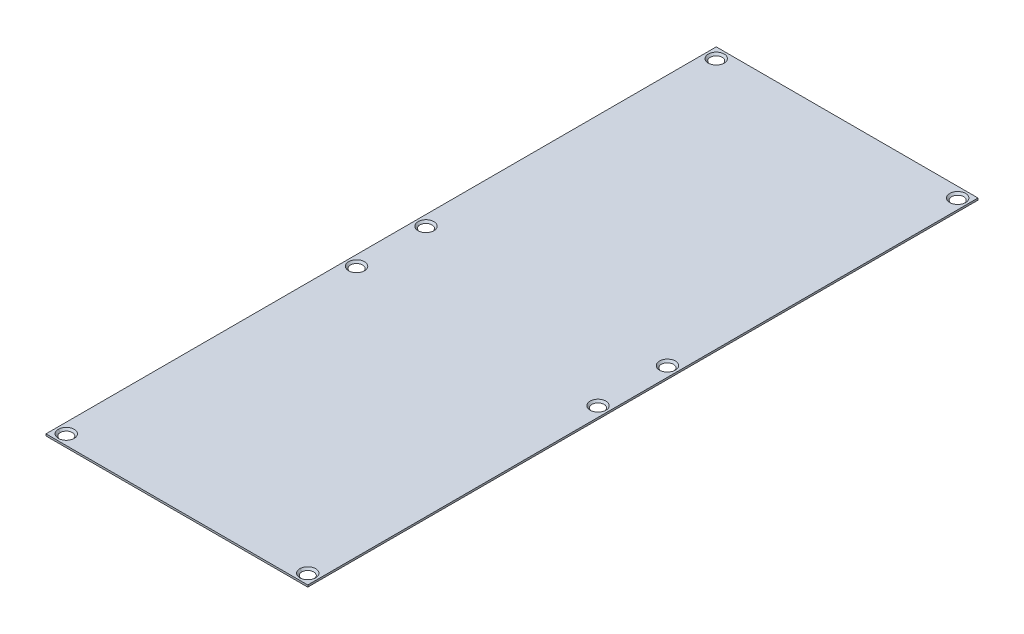
ISO-10303-21;
HEADER;
FILE_DESCRIPTION(('STEP AP214'),'2;1');
FILE_NAME('part.step','',(''),(''),'','','');
FILE_SCHEMA(('AUTOMOTIVE_DESIGN { 1 0 10303 214 1 1 1 1 }'));
ENDSEC;
DATA;
#1=APPLICATION_CONTEXT('core data for automotive mechanical design processes');
#2=APPLICATION_PROTOCOL_DEFINITION('international standard','automotive_design',2000,#1);
#3=PRODUCT_CONTEXT('',#1,'mechanical');
#4=PRODUCT('Part','Part','',(#3));
#5=PRODUCT_RELATED_PRODUCT_CATEGORY('part','',(#4));
#6=PRODUCT_DEFINITION_FORMATION('','',#4);
#7=PRODUCT_DEFINITION_CONTEXT('part definition',#1,'design');
#8=PRODUCT_DEFINITION('design','',#6,#7);
#9=PRODUCT_DEFINITION_SHAPE('','',#8);
#10=(LENGTH_UNIT() NAMED_UNIT(*) SI_UNIT(.MILLI.,.METRE.));
#11=(NAMED_UNIT(*) PLANE_ANGLE_UNIT() SI_UNIT($,.RADIAN.));
#12=(NAMED_UNIT(*) SI_UNIT($,.STERADIAN.) SOLID_ANGLE_UNIT());
#13=UNCERTAINTY_MEASURE_WITH_UNIT(LENGTH_MEASURE(1.E-05),#10,'distance_accuracy_value','');
#14=(GEOMETRIC_REPRESENTATION_CONTEXT(3) GLOBAL_UNCERTAINTY_ASSIGNED_CONTEXT((#13)) GLOBAL_UNIT_ASSIGNED_CONTEXT((#10,
#11,#12)) REPRESENTATION_CONTEXT('',''));
#15=CARTESIAN_POINT('',(0.,0.,0.));
#16=DIRECTION('',(0.,0.,1.));
#17=DIRECTION('',(1.,0.,0.));
#18=AXIS2_PLACEMENT_3D('',#15,#16,#17);
#19=CARTESIAN_POINT('',(50.,-0.2,113.5));
#20=DIRECTION('',(0.,1.,0.));
#21=DIRECTION('',(0.,0.,1.));
#22=AXIS2_PLACEMENT_3D('',#19,#20,#21);
#23=PLANE('',#22);
#24=CARTESIAN_POINT('',(88.1,-0.2,124.45));
#25=DIRECTION('',(0.,1.,0.));
#26=DIRECTION('',(0.,0.,1.));
#27=AXIS2_PLACEMENT_3D('',#24,#25,#26);
#28=CIRCLE('',#27,2.49996925633269);
#29=CARTESIAN_POINT('',(88.1,-0.2,126.949969256333));
#30=VERTEX_POINT('',#29);
#31=EDGE_CURVE('E131',#30,#30,#28,.F.);
#32=ORIENTED_EDGE('',*,*,#31,.T.);
#33=EDGE_LOOP('',(#32));
#34=FACE_BOUND('',#33,.T.);
#35=CARTESIAN_POINT('',(11.9,-0.2,216.05));
#36=DIRECTION('',(0.,1.,0.));
#37=DIRECTION('',(0.,0.,1.));
#38=AXIS2_PLACEMENT_3D('',#35,#36,#37);
#39=CIRCLE('',#38,2.49996925636078);
#40=CARTESIAN_POINT('',(14.3999692563546,-0.199999999971578,216.05));
#41=VERTEX_POINT('',#40);
#42=CARTESIAN_POINT('',(9.40003074361703,-0.199999999971578,216.05));
#43=VERTEX_POINT('',#42);
#44=EDGE_CURVE('E135',#41,#43,#39,.F.);
#45=ORIENTED_EDGE('',*,*,#44,.T.);
#46=CARTESIAN_POINT('',(11.9,-0.2,216.05));
#47=DIRECTION('',(0.,1.,0.));
#48=DIRECTION('',(0.,0.,1.));
#49=AXIS2_PLACEMENT_3D('',#46,#47,#48);
#50=CIRCLE('',#49,2.49996925636077);
#51=EDGE_CURVE('E139',#43,#41,#50,.F.);
#52=ORIENTED_EDGE('',*,*,#51,.T.);
#53=EDGE_LOOP('',(#45,#52));
#54=FACE_BOUND('',#53,.T.);
#55=CARTESIAN_POINT('',(11.9,-0.2,124.45));
#56=DIRECTION('',(0.,1.,0.));
#57=DIRECTION('',(0.,0.,1.));
#58=AXIS2_PLACEMENT_3D('',#55,#56,#57);
#59=CIRCLE('',#58,2.49996925633269);
#60=CARTESIAN_POINT('',(11.9,-0.2,126.949969256333));
#61=VERTEX_POINT('',#60);
#62=EDGE_CURVE('E142',#61,#61,#59,.F.);
#63=ORIENTED_EDGE('',*,*,#62,.T.);
#64=EDGE_LOOP('',(#63));
#65=FACE_BOUND('',#64,.T.);
#66=CARTESIAN_POINT('',(88.1,-0.2,102.55));
#67=DIRECTION('',(0.,1.,0.));
#68=DIRECTION('',(0.,0.,1.));
#69=AXIS2_PLACEMENT_3D('',#66,#67,#68);
#70=CIRCLE('',#69,2.49996925631623);
#71=CARTESIAN_POINT('',(88.1,-0.2,105.049969256316));
#72=VERTEX_POINT('',#71);
#73=EDGE_CURVE('E145',#72,#72,#70,.F.);
#74=ORIENTED_EDGE('',*,*,#73,.T.);
#75=EDGE_LOOP('',(#74));
#76=FACE_BOUND('',#75,.T.);
#77=CARTESIAN_POINT('',(11.9,-0.2,10.95));
#78=DIRECTION('',(0.,1.,0.));
#79=DIRECTION('',(0.,0.,1.));
#80=AXIS2_PLACEMENT_3D('',#77,#78,#79);
#81=CIRCLE('',#80,2.49996925634497);
#82=CARTESIAN_POINT('',(11.9,-0.2,13.449969256345));
#83=VERTEX_POINT('',#82);
#84=EDGE_CURVE('E148',#83,#83,#81,.F.);
#85=ORIENTED_EDGE('',*,*,#84,.T.);
#86=EDGE_LOOP('',(#85));
#87=FACE_BOUND('',#86,.T.);
#88=CARTESIAN_POINT('',(88.1,-0.2,10.95));
#89=DIRECTION('',(0.,1.,0.));
#90=DIRECTION('',(0.,0.,1.));
#91=AXIS2_PLACEMENT_3D('',#88,#89,#90);
#92=CIRCLE('',#91,2.49996925634497);
#93=CARTESIAN_POINT('',(88.1,-0.2,13.449969256345));
#94=VERTEX_POINT('',#93);
#95=EDGE_CURVE('E151',#94,#94,#92,.F.);
#96=ORIENTED_EDGE('',*,*,#95,.T.);
#97=EDGE_LOOP('',(#96));
#98=FACE_BOUND('',#97,.T.);
#99=CARTESIAN_POINT('',(11.9,-0.2,102.55));
#100=DIRECTION('',(0.,1.,0.));
#101=DIRECTION('',(0.,0.,1.));
#102=AXIS2_PLACEMENT_3D('',#99,#100,#101);
#103=CIRCLE('',#102,2.49996925631623);
#104=CARTESIAN_POINT('',(11.9,-0.2,105.049969256316));
#105=VERTEX_POINT('',#104);
#106=EDGE_CURVE('E154',#105,#105,#103,.F.);
#107=ORIENTED_EDGE('',*,*,#106,.T.);
#108=EDGE_LOOP('',(#107));
#109=FACE_BOUND('',#108,.T.);
#110=CARTESIAN_POINT('',(88.1,-0.2,216.05));
#111=DIRECTION('',(0.,1.,0.));
#112=DIRECTION('',(0.,0.,1.));
#113=AXIS2_PLACEMENT_3D('',#110,#111,#112);
#114=CIRCLE('',#113,2.49996925636077);
#115=CARTESIAN_POINT('',(90.5999692563261,-0.200000000028422,216.05));
#116=VERTEX_POINT('',#115);
#117=CARTESIAN_POINT('',(85.6000307436739,-0.200000000028422,216.05));
#118=VERTEX_POINT('',#117);
#119=EDGE_CURVE('E63',#116,#118,#114,.F.);
#120=ORIENTED_EDGE('',*,*,#119,.T.);
#121=CARTESIAN_POINT('',(88.1,-0.2,216.05));
#122=DIRECTION('',(0.,1.,0.));
#123=DIRECTION('',(0.,0.,1.));
#124=AXIS2_PLACEMENT_3D('',#121,#122,#123);
#125=CIRCLE('',#124,2.49996925636078);
#126=EDGE_CURVE('E20',#118,#116,#125,.F.);
#127=ORIENTED_EDGE('',*,*,#126,.T.);
#128=EDGE_LOOP('',(#120,#127));
#129=FACE_BOUND('',#128,.T.);
#130=DIRECTION('',(1.,0.,0.));
#131=VECTOR('',#130,1.);
#132=CARTESIAN_POINT('',(50.,-0.2,219.25));
#133=LINE('',#132,#131);
#134=CARTESIAN_POINT('',(91.3,-0.2,219.25));
#135=VERTEX_POINT('',#134);
#136=CARTESIAN_POINT('',(8.7,-0.2,219.25));
#137=VERTEX_POINT('',#136);
#138=EDGE_CURVE('E73',#135,#137,#133,.F.);
#139=ORIENTED_EDGE('',*,*,#138,.F.);
#140=DIRECTION('',(0.,0.,-1.));
#141=VECTOR('',#140,1.);
#142=CARTESIAN_POINT('',(91.3,-0.2,113.5));
#143=LINE('',#142,#141);
#144=CARTESIAN_POINT('',(91.3,-0.2,7.74999999999999));
#145=VERTEX_POINT('',#144);
#146=EDGE_CURVE('E87',#145,#135,#143,.F.);
#147=ORIENTED_EDGE('',*,*,#146,.F.);
#148=DIRECTION('',(1.,0.,0.));
#149=VECTOR('',#148,1.);
#150=CARTESIAN_POINT('',(50.,-0.2,7.75));
#151=LINE('',#150,#149);
#152=CARTESIAN_POINT('',(8.7,-0.2,7.75));
#153=VERTEX_POINT('',#152);
#154=EDGE_CURVE('E85',#145,#153,#151,.F.);
#155=ORIENTED_EDGE('',*,*,#154,.T.);
#156=DIRECTION('',(0.,0.,-1.));
#157=VECTOR('',#156,1.);
#158=CARTESIAN_POINT('',(8.7,-0.2,113.5));
#159=LINE('',#158,#157);
#160=EDGE_CURVE('E172',#153,#137,#159,.F.);
#161=ORIENTED_EDGE('',*,*,#160,.T.);
#162=EDGE_LOOP('',(#139,#147,#155,#161));
#163=FACE_BOUND('',#162,.T.);
#164=ADVANCED_FACE('F17',(#34,#54,#65,#76,#87,#98,#109,#129,#163),#23,.T.);
#165=CARTESIAN_POINT('',(91.3,-0.5,113.5));
#166=DIRECTION('',(1.,0.,0.));
#167=DIRECTION('',(0.,0.,-1.));
#168=AXIS2_PLACEMENT_3D('',#165,#166,#167);
#169=PLANE('',#168);
#170=DIRECTION('',(0.,1.,0.));
#171=VECTOR('',#170,1.);
#172=CARTESIAN_POINT('',(91.3,-0.5,219.25));
#173=LINE('',#172,#171);
#174=CARTESIAN_POINT('',(91.3,-0.8,219.25));
#175=VERTEX_POINT('',#174);
#176=EDGE_CURVE('E167',#175,#135,#173,.T.);
#177=ORIENTED_EDGE('',*,*,#176,.F.);
#178=DIRECTION('',(0.,0.,1.));
#179=VECTOR('',#178,1.);
#180=CARTESIAN_POINT('',(91.3,-0.8,113.5));
#181=LINE('',#180,#179);
#182=CARTESIAN_POINT('',(91.3,-0.8,7.74999999999999));
#183=VERTEX_POINT('',#182);
#184=EDGE_CURVE('E105',#175,#183,#181,.F.);
#185=ORIENTED_EDGE('',*,*,#184,.T.);
#186=DIRECTION('',(0.,1.,0.));
#187=VECTOR('',#186,1.);
#188=CARTESIAN_POINT('',(91.3,-0.5,7.75));
#189=LINE('',#188,#187);
#190=EDGE_CURVE('E91',#183,#145,#189,.T.);
#191=ORIENTED_EDGE('',*,*,#190,.T.);
#192=ORIENTED_EDGE('',*,*,#146,.T.);
#193=EDGE_LOOP('',(#177,#185,#191,#192));
#194=FACE_BOUND('',#193,.T.);
#195=ADVANCED_FACE('F103',(#194),#169,.T.);
#196=CARTESIAN_POINT('',(50.,-0.5,7.75));
#197=DIRECTION('',(0.,0.,1.));
#198=DIRECTION('',(1.,0.,0.));
#199=AXIS2_PLACEMENT_3D('',#196,#197,#198);
#200=PLANE('',#199);
#201=ORIENTED_EDGE('',*,*,#154,.F.);
#202=ORIENTED_EDGE('',*,*,#190,.F.);
#203=DIRECTION('',(1.,0.,0.));
#204=VECTOR('',#203,1.);
#205=CARTESIAN_POINT('',(50.,-0.8,7.74999999999999));
#206=LINE('',#205,#204);
#207=CARTESIAN_POINT('',(8.7,-0.8,7.75));
#208=VERTEX_POINT('',#207);
#209=EDGE_CURVE('E181',#183,#208,#206,.F.);
#210=ORIENTED_EDGE('',*,*,#209,.T.);
#211=DIRECTION('',(0.,1.,0.));
#212=VECTOR('',#211,1.);
#213=CARTESIAN_POINT('',(8.7,-0.5,7.74999999999999));
#214=LINE('',#213,#212);
#215=EDGE_CURVE('E100',#208,#153,#214,.T.);
#216=ORIENTED_EDGE('',*,*,#215,.T.);
#217=EDGE_LOOP('',(#201,#202,#210,#216));
#218=FACE_BOUND('',#217,.T.);
#219=ADVANCED_FACE('F96',(#218),#200,.F.);
#220=CARTESIAN_POINT('',(8.7,-0.5,113.5));
#221=DIRECTION('',(1.,0.,0.));
#222=DIRECTION('',(0.,0.,-1.));
#223=AXIS2_PLACEMENT_3D('',#220,#221,#222);
#224=PLANE('',#223);
#225=ORIENTED_EDGE('',*,*,#160,.F.);
#226=ORIENTED_EDGE('',*,*,#215,.F.);
#227=DIRECTION('',(0.,0.,1.));
#228=VECTOR('',#227,1.);
#229=CARTESIAN_POINT('',(8.7,-0.8,113.5));
#230=LINE('',#229,#228);
#231=CARTESIAN_POINT('',(8.7,-0.8,219.25));
#232=VERTEX_POINT('',#231);
#233=EDGE_CURVE('E177',#208,#232,#230,.T.);
#234=ORIENTED_EDGE('',*,*,#233,.T.);
#235=DIRECTION('',(0.,1.,0.));
#236=VECTOR('',#235,1.);
#237=CARTESIAN_POINT('',(8.7,-0.5,219.25));
#238=LINE('',#237,#236);
#239=EDGE_CURVE('E161',#137,#232,#238,.F.);
#240=ORIENTED_EDGE('',*,*,#239,.F.);
#241=EDGE_LOOP('',(#225,#226,#234,#240));
#242=FACE_BOUND('',#241,.T.);
#243=ADVANCED_FACE('F175',(#242),#224,.F.);
#244=CARTESIAN_POINT('',(50.,-0.5,219.25));
#245=DIRECTION('',(0.,0.,1.));
#246=DIRECTION('',(1.,0.,0.));
#247=AXIS2_PLACEMENT_3D('',#244,#245,#246);
#248=PLANE('',#247);
#249=ORIENTED_EDGE('',*,*,#239,.T.);
#250=DIRECTION('',(1.,0.,0.));
#251=VECTOR('',#250,1.);
#252=CARTESIAN_POINT('',(50.,-0.8,219.25));
#253=LINE('',#252,#251);
#254=EDGE_CURVE('E130',#232,#175,#253,.T.);
#255=ORIENTED_EDGE('',*,*,#254,.T.);
#256=ORIENTED_EDGE('',*,*,#176,.T.);
#257=ORIENTED_EDGE('',*,*,#138,.T.);
#258=EDGE_LOOP('',(#249,#255,#256,#257));
#259=FACE_BOUND('',#258,.T.);
#260=ADVANCED_FACE('F265',(#259),#248,.T.);
#261=CARTESIAN_POINT('',(88.1,-0.199989925818045,216.05));
#262=DIRECTION('',(0.,1.,0.));
#263=DIRECTION('',(0.,0.,1.));
#264=AXIS2_PLACEMENT_3D('',#261,#262,#263);
#265=CONICAL_SURFACE('',#264,2.49997933041884,0.785392014615525);
#266=CARTESIAN_POINT('',(88.1,-0.800000000026557,216.05));
#267=DIRECTION('',(0.,1.,0.));
#268=DIRECTION('',(0.,0.,1.));
#269=AXIS2_PLACEMENT_3D('',#266,#267,#268);
#270=CIRCLE('',#269,1.89997663482716);
#271=CARTESIAN_POINT('',(86.2000233651707,-0.799999999998136,216.05));
#272=VERTEX_POINT('',#271);
#273=CARTESIAN_POINT('',(89.9999766348294,-0.799999999969714,216.05));
#274=VERTEX_POINT('',#273);
#275=EDGE_CURVE('E128',#272,#274,#270,.F.);
#276=ORIENTED_EDGE('',*,*,#275,.T.);
#277=DIRECTION('',(-0.707102433349938,-0.707111128996423,0.));
#278=VECTOR('',#277,1.);
#279=CARTESIAN_POINT('',(498872.05,498787.383833936,216.050000000031));
#280=LINE('',#279,#278);
#281=EDGE_CURVE('E156',#274,#116,#280,.F.);
#282=ORIENTED_EDGE('',*,*,#281,.T.);
#283=ORIENTED_EDGE('',*,*,#126,.F.);
#284=DIRECTION('',(0.707102433349938,-0.707111128996423,0.));
#285=VECTOR('',#284,1.);
#286=CARTESIAN_POINT('',(-498695.85,498787.383833936,216.049999999908));
#287=LINE('',#286,#285);
#288=EDGE_CURVE('E157',#118,#272,#287,.T.);
#289=ORIENTED_EDGE('',*,*,#288,.T.);
#290=EDGE_LOOP('',(#276,#282,#283,#289));
#291=FACE_BOUND('',#290,.T.);
#292=ADVANCED_FACE('F224',(#291),#265,.F.);
#293=CARTESIAN_POINT('',(88.1,-0.199989925931732,216.05));
#294=DIRECTION('',(0.,1.,0.));
#295=DIRECTION('',(0.,0.,1.));
#296=AXIS2_PLACEMENT_3D('',#293,#294,#295);
#297=CONICAL_SURFACE('',#296,2.49997933030516,0.785392014662892);
#298=CARTESIAN_POINT('',(88.1,-0.799999999969714,216.05));
#299=DIRECTION('',(0.,1.,0.));
#300=DIRECTION('',(0.,0.,1.));
#301=AXIS2_PLACEMENT_3D('',#298,#299,#300);
#302=CIRCLE('',#301,1.89997663482716);
#303=EDGE_CURVE('E126',#274,#272,#302,.F.);
#304=ORIENTED_EDGE('',*,*,#303,.T.);
#305=ORIENTED_EDGE('',*,*,#288,.F.);
#306=ORIENTED_EDGE('',*,*,#119,.F.);
#307=ORIENTED_EDGE('',*,*,#281,.F.);
#308=EDGE_LOOP('',(#304,#305,#306,#307));
#309=FACE_BOUND('',#308,.T.);
#310=ADVANCED_FACE('F213',(#309),#297,.F.);
#311=CARTESIAN_POINT('',(11.9,-0.199989925818045,102.55));
#312=DIRECTION('',(0.,1.,0.));
#313=DIRECTION('',(0.,0.,1.));
#314=AXIS2_PLACEMENT_3D('',#311,#312,#313);
#315=CONICAL_SURFACE('',#314,2.4999793303743,0.785392014615524);
#316=CARTESIAN_POINT('',(11.9,-0.799999999969714,102.55));
#317=DIRECTION('',(0.,1.,0.));
#318=DIRECTION('',(0.,0.,1.));
#319=AXIS2_PLACEMENT_3D('',#316,#317,#318);
#320=CIRCLE('',#319,1.89997663483946);
#321=CARTESIAN_POINT('',(11.9,-0.799999999969714,104.449976634839));
#322=VERTEX_POINT('',#321);
#323=EDGE_CURVE('E123',#322,#322,#320,.F.);
#324=ORIENTED_EDGE('',*,*,#323,.T.);
#325=EDGE_LOOP('',(#324));
#326=FACE_BOUND('',#325,.T.);
#327=ORIENTED_EDGE('',*,*,#106,.F.);
#328=EDGE_LOOP('',(#327));
#329=FACE_BOUND('',#328,.T.);
#330=ADVANCED_FACE('F210',(#326,#329),#315,.F.);
#331=CARTESIAN_POINT('',(88.1,-0.199989925761201,10.95));
#332=DIRECTION('',(0.,1.,0.));
#333=DIRECTION('',(0.,0.,1.));
#334=AXIS2_PLACEMENT_3D('',#331,#332,#333);
#335=CONICAL_SURFACE('',#334,2.49997933045988,0.785392014615523);
#336=CARTESIAN_POINT('',(88.1,-0.799999999969714,10.95));
#337=DIRECTION('',(0.,1.,0.));
#338=DIRECTION('',(0.,0.,1.));
#339=AXIS2_PLACEMENT_3D('',#336,#337,#338);
#340=CIRCLE('',#339,1.8999766348682);
#341=CARTESIAN_POINT('',(88.1,-0.799999999969714,12.8499766348682));
#342=VERTEX_POINT('',#341);
#343=EDGE_CURVE('E120',#342,#342,#340,.F.);
#344=ORIENTED_EDGE('',*,*,#343,.T.);
#345=EDGE_LOOP('',(#344));
#346=FACE_BOUND('',#345,.T.);
#347=ORIENTED_EDGE('',*,*,#95,.F.);
#348=EDGE_LOOP('',(#347));
#349=FACE_BOUND('',#348,.T.);
#350=ADVANCED_FACE('F212',(#346,#349),#335,.F.);
#351=CARTESIAN_POINT('',(11.9,-0.199989925761201,10.95));
#352=DIRECTION('',(0.,1.,0.));
#353=DIRECTION('',(0.,0.,1.));
#354=AXIS2_PLACEMENT_3D('',#351,#352,#353);
#355=CONICAL_SURFACE('',#354,2.49997933045988,0.785392014615523);
#356=CARTESIAN_POINT('',(11.9,-0.799999999969714,10.95));
#357=DIRECTION('',(0.,1.,0.));
#358=DIRECTION('',(0.,0.,1.));
#359=AXIS2_PLACEMENT_3D('',#356,#357,#358);
#360=CIRCLE('',#359,1.8999766348682);
#361=CARTESIAN_POINT('',(11.9,-0.799999999969714,12.8499766348682));
#362=VERTEX_POINT('',#361);
#363=EDGE_CURVE('E117',#362,#362,#360,.F.);
#364=ORIENTED_EDGE('',*,*,#363,.T.);
#365=EDGE_LOOP('',(#364));
#366=FACE_BOUND('',#365,.T.);
#367=ORIENTED_EDGE('',*,*,#84,.F.);
#368=EDGE_LOOP('',(#367));
#369=FACE_BOUND('',#368,.T.);
#370=ADVANCED_FACE('F221',(#366,#369),#355,.F.);
#371=CARTESIAN_POINT('',(88.1,-0.199989925818045,102.55));
#372=DIRECTION('',(0.,1.,0.));
#373=DIRECTION('',(0.,0.,1.));
#374=AXIS2_PLACEMENT_3D('',#371,#372,#373);
#375=CONICAL_SURFACE('',#374,2.4999793303743,0.785392014615524);
#376=CARTESIAN_POINT('',(88.1,-0.799999999969714,102.55));
#377=DIRECTION('',(0.,1.,0.));
#378=DIRECTION('',(0.,0.,1.));
#379=AXIS2_PLACEMENT_3D('',#376,#377,#378);
#380=CIRCLE('',#379,1.89997663483946);
#381=CARTESIAN_POINT('',(88.1,-0.799999999969714,104.449976634839));
#382=VERTEX_POINT('',#381);
#383=EDGE_CURVE('E114',#382,#382,#380,.F.);
#384=ORIENTED_EDGE('',*,*,#383,.T.);
#385=EDGE_LOOP('',(#384));
#386=FACE_BOUND('',#385,.T.);
#387=ORIENTED_EDGE('',*,*,#73,.F.);
#388=EDGE_LOOP('',(#387));
#389=FACE_BOUND('',#388,.T.);
#390=ADVANCED_FACE('F244',(#386,#389),#375,.F.);
#391=CARTESIAN_POINT('',(11.9,-0.199989925818045,124.45));
#392=DIRECTION('',(0.,1.,0.));
#393=DIRECTION('',(0.,0.,1.));
#394=AXIS2_PLACEMENT_3D('',#391,#392,#393);
#395=CONICAL_SURFACE('',#394,2.49997933039076,0.785392014615525);
#396=CARTESIAN_POINT('',(11.9,-0.799999999969714,124.45));
#397=DIRECTION('',(0.,1.,0.));
#398=DIRECTION('',(0.,0.,1.));
#399=AXIS2_PLACEMENT_3D('',#396,#397,#398);
#400=CIRCLE('',#399,1.89997663485591);
#401=CARTESIAN_POINT('',(11.9,-0.799999999969714,126.349976634856));
#402=VERTEX_POINT('',#401);
#403=EDGE_CURVE('E111',#402,#402,#400,.F.);
#404=ORIENTED_EDGE('',*,*,#403,.T.);
#405=EDGE_LOOP('',(#404));
#406=FACE_BOUND('',#405,.T.);
#407=ORIENTED_EDGE('',*,*,#62,.F.);
#408=EDGE_LOOP('',(#407));
#409=FACE_BOUND('',#408,.T.);
#410=ADVANCED_FACE('F241',(#406,#409),#395,.F.);
#411=CARTESIAN_POINT('',(11.9,-0.199989925931732,216.05));
#412=DIRECTION('',(0.,1.,0.));
#413=DIRECTION('',(0.,0.,1.));
#414=AXIS2_PLACEMENT_3D('',#411,#412,#413);
#415=CONICAL_SURFACE('',#414,2.49997933030516,0.785392014662892);
#416=CARTESIAN_POINT('',(11.9,-0.799999999969714,216.05));
#417=DIRECTION('',(0.,1.,0.));
#418=DIRECTION('',(0.,0.,1.));
#419=AXIS2_PLACEMENT_3D('',#416,#417,#418);
#420=CIRCLE('',#419,1.89997663482716);
#421=CARTESIAN_POINT('',(10.0000233651706,-0.799999999998136,216.05));
#422=VERTEX_POINT('',#421);
#423=CARTESIAN_POINT('',(13.7999766348009,-0.800000000026557,216.05));
#424=VERTEX_POINT('',#423);
#425=EDGE_CURVE('E35',#422,#424,#420,.F.);
#426=ORIENTED_EDGE('',*,*,#425,.T.);
#427=DIRECTION('',(-0.707102433349938,-0.707111128996423,0.));
#428=VECTOR('',#427,1.);
#429=CARTESIAN_POINT('',(498795.85,498787.383833935,216.050000000031));
#430=LINE('',#429,#428);
#431=EDGE_CURVE('E134',#424,#41,#430,.F.);
#432=ORIENTED_EDGE('',*,*,#431,.T.);
#433=ORIENTED_EDGE('',*,*,#51,.F.);
#434=DIRECTION('',(0.707102433349938,-0.707111128996423,0.));
#435=VECTOR('',#434,1.);
#436=CARTESIAN_POINT('',(-498772.05,498787.383833935,216.049999999908));
#437=LINE('',#436,#435);
#438=EDGE_CURVE('E138',#43,#422,#437,.T.);
#439=ORIENTED_EDGE('',*,*,#438,.T.);
#440=EDGE_LOOP('',(#426,#432,#433,#439));
#441=FACE_BOUND('',#440,.T.);
#442=ADVANCED_FACE('F188',(#441),#415,.F.);
#443=CARTESIAN_POINT('',(11.9,-0.199989925818045,216.05));
#444=DIRECTION('',(0.,1.,0.));
#445=DIRECTION('',(0.,0.,1.));
#446=AXIS2_PLACEMENT_3D('',#443,#444,#445);
#447=CONICAL_SURFACE('',#446,2.49997933041884,0.785392014615525);
#448=CARTESIAN_POINT('',(11.9,-0.800000000026557,216.05));
#449=DIRECTION('',(0.,1.,0.));
#450=DIRECTION('',(0.,0.,1.));
#451=AXIS2_PLACEMENT_3D('',#448,#449,#450);
#452=CIRCLE('',#451,1.89997663482716);
#453=EDGE_CURVE('E26',#424,#422,#452,.F.);
#454=ORIENTED_EDGE('',*,*,#453,.T.);
#455=ORIENTED_EDGE('',*,*,#438,.F.);
#456=ORIENTED_EDGE('',*,*,#44,.F.);
#457=ORIENTED_EDGE('',*,*,#431,.F.);
#458=EDGE_LOOP('',(#454,#455,#456,#457));
#459=FACE_BOUND('',#458,.T.);
#460=ADVANCED_FACE('F192',(#459),#447,.F.);
#461=CARTESIAN_POINT('',(88.1,-0.199989925818045,124.45));
#462=DIRECTION('',(0.,1.,0.));
#463=DIRECTION('',(0.,0.,1.));
#464=AXIS2_PLACEMENT_3D('',#461,#462,#463);
#465=CONICAL_SURFACE('',#464,2.49997933039076,0.785392014615525);
#466=CARTESIAN_POINT('',(88.1,-0.799999999969714,124.45));
#467=DIRECTION('',(0.,1.,0.));
#468=DIRECTION('',(0.,0.,1.));
#469=AXIS2_PLACEMENT_3D('',#466,#467,#468);
#470=CIRCLE('',#469,1.89997663485591);
#471=CARTESIAN_POINT('',(88.1,-0.799999999969714,126.349976634856));
#472=VERTEX_POINT('',#471);
#473=EDGE_CURVE('E11',#472,#472,#470,.F.);
#474=ORIENTED_EDGE('',*,*,#473,.T.);
#475=EDGE_LOOP('',(#474));
#476=FACE_BOUND('',#475,.T.);
#477=ORIENTED_EDGE('',*,*,#31,.F.);
#478=EDGE_LOOP('',(#477));
#479=FACE_BOUND('',#478,.T.);
#480=ADVANCED_FACE('F227',(#476,#479),#465,.F.);
#481=CARTESIAN_POINT('',(50.,-0.8,113.5));
#482=DIRECTION('',(0.,1.,0.));
#483=DIRECTION('',(0.,0.,1.));
#484=AXIS2_PLACEMENT_3D('',#481,#482,#483);
#485=PLANE('',#484);
#486=ORIENTED_EDGE('',*,*,#473,.F.);
#487=EDGE_LOOP('',(#486));
#488=FACE_BOUND('',#487,.T.);
#489=ORIENTED_EDGE('',*,*,#453,.F.);
#490=ORIENTED_EDGE('',*,*,#425,.F.);
#491=EDGE_LOOP('',(#489,#490));
#492=FACE_BOUND('',#491,.T.);
#493=ORIENTED_EDGE('',*,*,#403,.F.);
#494=EDGE_LOOP('',(#493));
#495=FACE_BOUND('',#494,.T.);
#496=ORIENTED_EDGE('',*,*,#383,.F.);
#497=EDGE_LOOP('',(#496));
#498=FACE_BOUND('',#497,.T.);
#499=ORIENTED_EDGE('',*,*,#363,.F.);
#500=EDGE_LOOP('',(#499));
#501=FACE_BOUND('',#500,.T.);
#502=ORIENTED_EDGE('',*,*,#343,.F.);
#503=EDGE_LOOP('',(#502));
#504=FACE_BOUND('',#503,.T.);
#505=ORIENTED_EDGE('',*,*,#323,.F.);
#506=EDGE_LOOP('',(#505));
#507=FACE_BOUND('',#506,.T.);
#508=ORIENTED_EDGE('',*,*,#303,.F.);
#509=ORIENTED_EDGE('',*,*,#275,.F.);
#510=EDGE_LOOP('',(#508,#509));
#511=FACE_BOUND('',#510,.T.);
#512=ORIENTED_EDGE('',*,*,#233,.F.);
#513=ORIENTED_EDGE('',*,*,#209,.F.);
#514=ORIENTED_EDGE('',*,*,#184,.F.);
#515=ORIENTED_EDGE('',*,*,#254,.F.);
#516=EDGE_LOOP('',(#512,#513,#514,#515));
#517=FACE_BOUND('',#516,.T.);
#518=ADVANCED_FACE('F194',(#488,#492,#495,#498,#501,#504,#507,#511,#517),#485,.F.);
#519=CLOSED_SHELL('',(#164,#195,#219,#243,#260,#292,#310,#330,#350,#370,#390,#410,#442,#460,
#480,#518));
#520=MANIFOLD_SOLID_BREP('B1',#519);
#521=ADVANCED_BREP_SHAPE_REPRESENTATION('',(#18,#520),#14);
#522=SHAPE_DEFINITION_REPRESENTATION(#9,#521);
ENDSEC;
END-ISO-10303-21;
